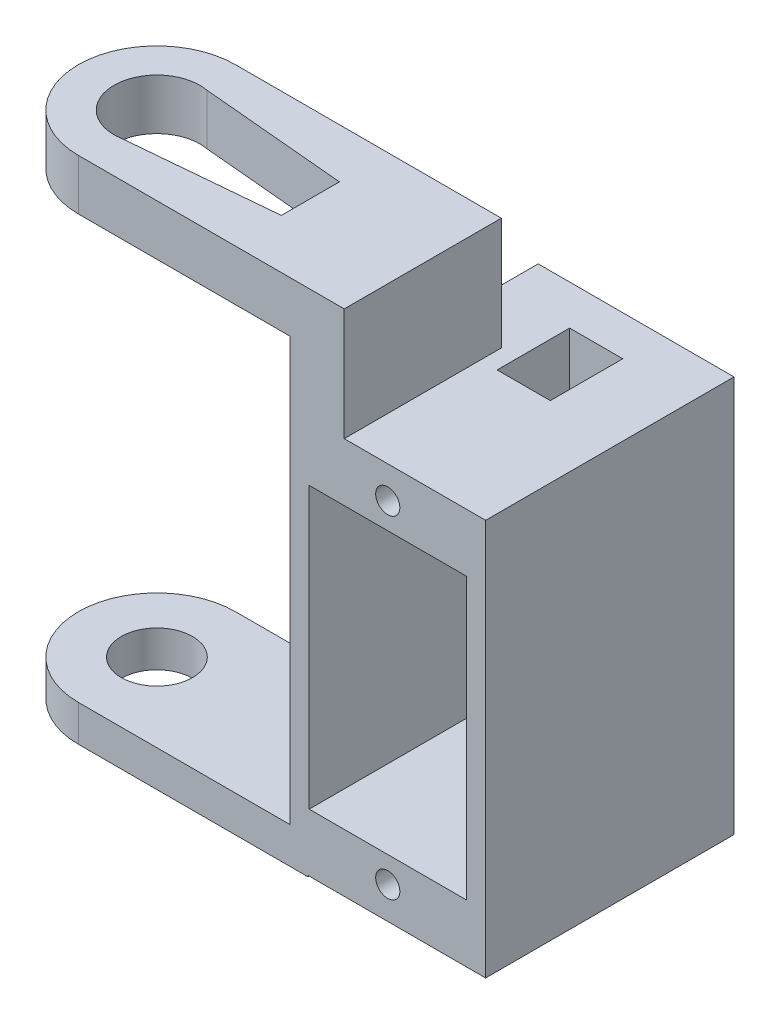
ISO-10303-21;
HEADER;
FILE_DESCRIPTION(('STEP AP214'),'2;1');
FILE_NAME('part.step','',(''),(''),'','','');
FILE_SCHEMA(('AUTOMOTIVE_DESIGN { 1 0 10303 214 1 1 1 1 }'));
ENDSEC;
DATA;
#1=APPLICATION_CONTEXT('core data for automotive mechanical design processes');
#2=APPLICATION_PROTOCOL_DEFINITION('international standard','automotive_design',2000,#1);
#3=PRODUCT_CONTEXT('',#1,'mechanical');
#4=PRODUCT('Part','Part','',(#3));
#5=PRODUCT_RELATED_PRODUCT_CATEGORY('part','',(#4));
#6=PRODUCT_DEFINITION_FORMATION('','',#4);
#7=PRODUCT_DEFINITION_CONTEXT('part definition',#1,'design');
#8=PRODUCT_DEFINITION('design','',#6,#7);
#9=PRODUCT_DEFINITION_SHAPE('','',#8);
#10=(LENGTH_UNIT() NAMED_UNIT(*) SI_UNIT(.MILLI.,.METRE.));
#11=(NAMED_UNIT(*) PLANE_ANGLE_UNIT() SI_UNIT($,.RADIAN.));
#12=(NAMED_UNIT(*) SI_UNIT($,.STERADIAN.) SOLID_ANGLE_UNIT());
#13=UNCERTAINTY_MEASURE_WITH_UNIT(LENGTH_MEASURE(1.E-05),#10,'distance_accuracy_value','');
#14=(GEOMETRIC_REPRESENTATION_CONTEXT(3) GLOBAL_UNCERTAINTY_ASSIGNED_CONTEXT((#13)) GLOBAL_UNIT_ASSIGNED_CONTEXT((#10,
#11,#12)) REPRESENTATION_CONTEXT('',''));
#15=CARTESIAN_POINT('',(0.,0.,0.));
#16=DIRECTION('',(0.,0.,1.));
#17=DIRECTION('',(1.,0.,0.));
#18=AXIS2_PLACEMENT_3D('',#15,#16,#17);
#19=CARTESIAN_POINT('',(-67.5,42.6,6.5));
#20=DIRECTION('',(1.,0.,0.));
#21=DIRECTION('',(0.,0.,-1.));
#22=AXIS2_PLACEMENT_3D('',#19,#20,#21);
#23=PLANE('',#22);
#24=DIRECTION('',(0.,-1.,0.));
#25=VECTOR('',#24,1.);
#26=CARTESIAN_POINT('',(-67.5,42.6,-6.5));
#27=LINE('',#26,#25);
#28=CARTESIAN_POINT('',(-67.5,45.5,-6.5));
#29=VERTEX_POINT('',#28);
#30=CARTESIAN_POINT('',(-67.5,42.6,-6.5));
#31=VERTEX_POINT('',#30);
#32=EDGE_CURVE('E379',#29,#31,#27,.T.);
#33=ORIENTED_EDGE('',*,*,#32,.F.);
#34=DIRECTION('',(0.,0.,-1.));
#35=VECTOR('',#34,1.);
#36=CARTESIAN_POINT('',(-67.5,45.5,6.5));
#37=LINE('',#36,#35);
#38=CARTESIAN_POINT('',(-67.5,45.5,6.5));
#39=VERTEX_POINT('',#38);
#40=EDGE_CURVE('E371',#39,#29,#37,.T.);
#41=ORIENTED_EDGE('',*,*,#40,.F.);
#42=DIRECTION('',(0.,-1.,0.));
#43=VECTOR('',#42,1.);
#44=CARTESIAN_POINT('',(-67.5,42.6,6.5));
#45=LINE('',#44,#43);
#46=CARTESIAN_POINT('',(-67.5,80.5,6.50000000000001));
#47=VERTEX_POINT('',#46);
#48=EDGE_CURVE('E470',#47,#39,#45,.T.);
#49=ORIENTED_EDGE('',*,*,#48,.F.);
#50=DIRECTION('',(0.,0.,-1.));
#51=VECTOR('',#50,1.);
#52=CARTESIAN_POINT('',(-67.5,80.5,6.5));
#53=LINE('',#52,#51);
#54=CARTESIAN_POINT('',(-67.5,80.5,-6.5));
#55=VERTEX_POINT('',#54);
#56=EDGE_CURVE('E443',#47,#55,#53,.T.);
#57=ORIENTED_EDGE('',*,*,#56,.T.);
#58=DIRECTION('',(0.,1.,0.));
#59=VECTOR('',#58,1.);
#60=CARTESIAN_POINT('',(-67.5,73.,-6.5));
#61=LINE('',#60,#59);
#62=CARTESIAN_POINT('',(-67.5,75.4,-6.5));
#63=VERTEX_POINT('',#62);
#64=EDGE_CURVE('E447',#63,#55,#61,.T.);
#65=ORIENTED_EDGE('',*,*,#64,.F.);
#66=DIRECTION('',(0.,0.,-1.));
#67=VECTOR('',#66,1.);
#68=CARTESIAN_POINT('',(-67.5,75.4,6.5));
#69=LINE('',#68,#67);
#70=CARTESIAN_POINT('',(-67.5,75.4,-14.05));
#71=VERTEX_POINT('',#70);
#72=EDGE_CURVE('E485',#63,#71,#69,.T.);
#73=ORIENTED_EDGE('',*,*,#72,.T.);
#74=DIRECTION('',(0.,-1.,0.));
#75=VECTOR('',#74,1.);
#76=CARTESIAN_POINT('',(-67.5,42.6,-14.05));
#77=LINE('',#76,#75);
#78=CARTESIAN_POINT('',(-67.5,42.6,-14.05));
#79=VERTEX_POINT('',#78);
#80=EDGE_CURVE('E469',#71,#79,#77,.T.);
#81=ORIENTED_EDGE('',*,*,#80,.T.);
#82=DIRECTION('',(0.,0.,-1.));
#83=VECTOR('',#82,1.);
#84=CARTESIAN_POINT('',(-67.5,42.6,6.5));
#85=LINE('',#84,#83);
#86=EDGE_CURVE('E508',#31,#79,#85,.T.);
#87=ORIENTED_EDGE('',*,*,#86,.F.);
#88=EDGE_LOOP('',(#33,#41,#49,#57,#65,#73,#81,#87));
#89=FACE_BOUND('',#88,.T.);
#90=ADVANCED_FACE('F39',(#89),#23,.F.);
#91=CARTESIAN_POINT('',(-67.5,42.6,6.5));
#92=DIRECTION('',(0.,1.,0.));
#93=DIRECTION('',(0.,0.,1.));
#94=AXIS2_PLACEMENT_3D('',#91,#92,#93);
#95=PLANE('',#94);
#96=DIRECTION('',(0.,0.,1.));
#97=VECTOR('',#96,1.);
#98=CARTESIAN_POINT('',(-66.,42.6,6.5));
#99=LINE('',#98,#97);
#100=CARTESIAN_POINT('',(-66.,42.6,-6.5));
#101=VERTEX_POINT('',#100);
#102=CARTESIAN_POINT('',(-66.,42.6,6.5));
#103=VERTEX_POINT('',#102);
#104=EDGE_CURVE('E375',#101,#103,#99,.T.);
#105=ORIENTED_EDGE('',*,*,#104,.F.);
#106=DIRECTION('',(1.,0.,0.));
#107=VECTOR('',#106,1.);
#108=CARTESIAN_POINT('',(-67.5,42.6,-6.5));
#109=LINE('',#108,#107);
#110=EDGE_CURVE('E11',#31,#101,#109,.T.);
#111=ORIENTED_EDGE('',*,*,#110,.F.);
#112=ORIENTED_EDGE('',*,*,#86,.T.);
#113=DIRECTION('',(1.,0.,0.));
#114=VECTOR('',#113,1.);
#115=CARTESIAN_POINT('',(-67.5,42.6,-14.05));
#116=LINE('',#115,#114);
#117=CARTESIAN_POINT('',(-51.3,42.6,-14.05));
#118=VERTEX_POINT('',#117);
#119=EDGE_CURVE('E489',#79,#118,#116,.T.);
#120=ORIENTED_EDGE('',*,*,#119,.T.);
#121=DIRECTION('',(0.,0.,-1.));
#122=VECTOR('',#121,1.);
#123=CARTESIAN_POINT('',(-51.3,42.6,6.5));
#124=LINE('',#123,#122);
#125=CARTESIAN_POINT('',(-51.3,42.6,6.5));
#126=VERTEX_POINT('',#125);
#127=EDGE_CURVE('E504',#126,#118,#124,.T.);
#128=ORIENTED_EDGE('',*,*,#127,.F.);
#129=DIRECTION('',(1.,0.,0.));
#130=VECTOR('',#129,1.);
#131=CARTESIAN_POINT('',(-67.5,42.6,6.5));
#132=LINE('',#131,#130);
#133=EDGE_CURVE('E474',#103,#126,#132,.T.);
#134=ORIENTED_EDGE('',*,*,#133,.F.);
#135=EDGE_LOOP('',(#105,#111,#112,#120,#128,#134));
#136=FACE_BOUND('',#135,.T.);
#137=ADVANCED_FACE('F551',(#136),#95,.F.);
#138=CARTESIAN_POINT('',(-67.5,75.4,6.5));
#139=DIRECTION('',(0.,-1.,0.));
#140=DIRECTION('',(0.,0.,-1.));
#141=AXIS2_PLACEMENT_3D('',#138,#139,#140);
#142=PLANE('',#141);
#143=DIRECTION('',(1.,0.,0.));
#144=VECTOR('',#143,1.);
#145=CARTESIAN_POINT('',(-61.6,75.4,-4.75));
#146=LINE('',#145,#144);
#147=CARTESIAN_POINT('',(-61.6,75.4,-4.75));
#148=VERTEX_POINT('',#147);
#149=CARTESIAN_POINT('',(-57.2,75.4,-4.75));
#150=VERTEX_POINT('',#149);
#151=EDGE_CURVE('E242',#148,#150,#146,.T.);
#152=ORIENTED_EDGE('',*,*,#151,.F.);
#153=DIRECTION('',(0.,0.,1.));
#154=VECTOR('',#153,1.);
#155=CARTESIAN_POINT('',(-61.6,75.4,-4.75));
#156=LINE('',#155,#154);
#157=CARTESIAN_POINT('',(-61.6,75.4,-10.75));
#158=VERTEX_POINT('',#157);
#159=EDGE_CURVE('E54',#158,#148,#156,.T.);
#160=ORIENTED_EDGE('',*,*,#159,.F.);
#161=DIRECTION('',(-1.,0.,0.));
#162=VECTOR('',#161,1.);
#163=CARTESIAN_POINT('',(-61.6,75.4,-10.75));
#164=LINE('',#163,#162);
#165=CARTESIAN_POINT('',(-57.2,75.4,-10.75));
#166=VERTEX_POINT('',#165);
#167=EDGE_CURVE('E231',#166,#158,#164,.T.);
#168=ORIENTED_EDGE('',*,*,#167,.F.);
#169=DIRECTION('',(0.,0.,-1.));
#170=VECTOR('',#169,1.);
#171=CARTESIAN_POINT('',(-57.2,75.4,-4.75));
#172=LINE('',#171,#170);
#173=EDGE_CURVE('E235',#150,#166,#172,.T.);
#174=ORIENTED_EDGE('',*,*,#173,.F.);
#175=EDGE_LOOP('',(#152,#160,#168,#174));
#176=FACE_BOUND('',#175,.T.);
#177=DIRECTION('',(-1.,0.,0.));
#178=VECTOR('',#177,1.);
#179=CARTESIAN_POINT('',(-67.5,75.4,-6.5));
#180=LINE('',#179,#178);
#181=CARTESIAN_POINT('',(-63.,75.4,-6.5));
#182=VERTEX_POINT('',#181);
#183=EDGE_CURVE('E511',#182,#63,#180,.T.);
#184=ORIENTED_EDGE('',*,*,#183,.F.);
#185=DIRECTION('',(0.,0.,-1.));
#186=VECTOR('',#185,1.);
#187=CARTESIAN_POINT('',(-63.,75.4,6.5));
#188=LINE('',#187,#186);
#189=CARTESIAN_POINT('',(-63.,75.4,6.5));
#190=VERTEX_POINT('',#189);
#191=EDGE_CURVE('E466',#190,#182,#188,.T.);
#192=ORIENTED_EDGE('',*,*,#191,.F.);
#193=DIRECTION('',(-1.,0.,0.));
#194=VECTOR('',#193,1.);
#195=CARTESIAN_POINT('',(-67.5,75.4,6.5));
#196=LINE('',#195,#194);
#197=CARTESIAN_POINT('',(-51.3,75.4,6.5));
#198=VERTEX_POINT('',#197);
#199=EDGE_CURVE('E481',#198,#190,#196,.T.);
#200=ORIENTED_EDGE('',*,*,#199,.F.);
#201=DIRECTION('',(0.,0.,-1.));
#202=VECTOR('',#201,1.);
#203=CARTESIAN_POINT('',(-51.3,75.4,6.5));
#204=LINE('',#203,#202);
#205=CARTESIAN_POINT('',(-51.3,75.4,-14.05));
#206=VERTEX_POINT('',#205);
#207=EDGE_CURVE('E500',#198,#206,#204,.T.);
#208=ORIENTED_EDGE('',*,*,#207,.T.);
#209=DIRECTION('',(-1.,0.,0.));
#210=VECTOR('',#209,1.);
#211=CARTESIAN_POINT('',(-67.5,75.4,-14.05));
#212=LINE('',#211,#210);
#213=EDGE_CURVE('E475',#206,#71,#212,.T.);
#214=ORIENTED_EDGE('',*,*,#213,.T.);
#215=ORIENTED_EDGE('',*,*,#72,.F.);
#216=EDGE_LOOP('',(#184,#192,#200,#208,#214,#215));
#217=FACE_BOUND('',#216,.T.);
#218=ADVANCED_FACE('F556',(#176,#217),#142,.F.);
#219=CARTESIAN_POINT('',(-51.3,42.6,6.5));
#220=DIRECTION('',(-1.,0.,0.));
#221=DIRECTION('',(0.,0.,1.));
#222=AXIS2_PLACEMENT_3D('',#219,#220,#221);
#223=PLANE('',#222);
#224=DIRECTION('',(0.,1.,0.));
#225=VECTOR('',#224,1.);
#226=CARTESIAN_POINT('',(-51.3,42.6,-14.05));
#227=LINE('',#226,#225);
#228=EDGE_CURVE('E492',#118,#206,#227,.T.);
#229=ORIENTED_EDGE('',*,*,#228,.T.);
#230=ORIENTED_EDGE('',*,*,#207,.F.);
#231=DIRECTION('',(0.,1.,0.));
#232=VECTOR('',#231,1.);
#233=CARTESIAN_POINT('',(-51.3,42.6,6.5));
#234=LINE('',#233,#232);
#235=EDGE_CURVE('E478',#126,#198,#234,.T.);
#236=ORIENTED_EDGE('',*,*,#235,.F.);
#237=ORIENTED_EDGE('',*,*,#127,.T.);
#238=EDGE_LOOP('',(#229,#230,#236,#237));
#239=FACE_BOUND('',#238,.T.);
#240=ADVANCED_FACE('F587',(#239),#223,.F.);
#241=CARTESIAN_POINT('',(0.,0.,6.5));
#242=DIRECTION('',(0.,0.,-1.));
#243=DIRECTION('',(-1.,0.,0.));
#244=AXIS2_PLACEMENT_3D('',#241,#242,#243);
#245=PLANE('',#244);
#246=CARTESIAN_POINT('',(-59.4,72.75,6.5));
#247=DIRECTION('',(0.,0.,1.));
#248=DIRECTION('',(1.,0.,0.));
#249=AXIS2_PLACEMENT_3D('',#246,#247,#248);
#250=CIRCLE('',#249,1.);
#251=CARTESIAN_POINT('',(-58.4,72.75,6.5));
#252=VERTEX_POINT('',#251);
#253=EDGE_CURVE('E261',#252,#252,#250,.T.);
#254=ORIENTED_EDGE('',*,*,#253,.F.);
#255=EDGE_LOOP('',(#254));
#256=FACE_BOUND('',#255,.T.);
#257=CARTESIAN_POINT('',(-59.4,45.25,6.5));
#258=DIRECTION('',(0.,0.,1.));
#259=DIRECTION('',(1.,0.,0.));
#260=AXIS2_PLACEMENT_3D('',#257,#258,#259);
#261=CIRCLE('',#260,1.);
#262=CARTESIAN_POINT('',(-58.4,45.25,6.5));
#263=VERTEX_POINT('',#262);
#264=EDGE_CURVE('E269',#263,#263,#261,.T.);
#265=ORIENTED_EDGE('',*,*,#264,.F.);
#266=EDGE_LOOP('',(#265));
#267=FACE_BOUND('',#266,.T.);
#268=DIRECTION('',(1.,0.,0.));
#269=VECTOR('',#268,1.);
#270=CARTESIAN_POINT('',(-65.9,47.4,6.5));
#271=LINE('',#270,#269);
#272=CARTESIAN_POINT('',(-65.9,47.4,6.5));
#273=VERTEX_POINT('',#272);
#274=CARTESIAN_POINT('',(-52.9,47.4,6.5));
#275=VERTEX_POINT('',#274);
#276=EDGE_CURVE('E301',#273,#275,#271,.T.);
#277=ORIENTED_EDGE('',*,*,#276,.F.);
#278=DIRECTION('',(0.,-1.,0.));
#279=VECTOR('',#278,1.);
#280=CARTESIAN_POINT('',(-65.9,47.4,6.5));
#281=LINE('',#280,#279);
#282=CARTESIAN_POINT('',(-65.9,70.6,6.5));
#283=VERTEX_POINT('',#282);
#284=EDGE_CURVE('E277',#283,#273,#281,.T.);
#285=ORIENTED_EDGE('',*,*,#284,.F.);
#286=DIRECTION('',(-1.,0.,0.));
#287=VECTOR('',#286,1.);
#288=CARTESIAN_POINT('',(-65.9,70.6,6.5));
#289=LINE('',#288,#287);
#290=CARTESIAN_POINT('',(-52.9,70.6,6.5));
#291=VERTEX_POINT('',#290);
#292=EDGE_CURVE('E286',#291,#283,#289,.T.);
#293=ORIENTED_EDGE('',*,*,#292,.F.);
#294=DIRECTION('',(0.,1.,0.));
#295=VECTOR('',#294,1.);
#296=CARTESIAN_POINT('',(-52.9,47.4,6.5));
#297=LINE('',#296,#295);
#298=EDGE_CURVE('E305',#275,#291,#297,.T.);
#299=ORIENTED_EDGE('',*,*,#298,.F.);
#300=EDGE_LOOP('',(#277,#285,#293,#299));
#301=FACE_BOUND('',#300,.T.);
#302=ORIENTED_EDGE('',*,*,#48,.T.);
#303=DIRECTION('',(1.,0.,0.));
#304=VECTOR('',#303,1.);
#305=CARTESIAN_POINT('',(-85.,45.5,6.50000000000001));
#306=LINE('',#305,#304);
#307=CARTESIAN_POINT('',(-85.,45.5,6.50000000000001));
#308=VERTEX_POINT('',#307);
#309=EDGE_CURVE('E341',#308,#39,#306,.T.);
#310=ORIENTED_EDGE('',*,*,#309,.F.);
#311=DIRECTION('',(0.,-1.,0.));
#312=VECTOR('',#311,1.);
#313=CARTESIAN_POINT('',(-85.,45.5,6.50000000000001));
#314=LINE('',#313,#312);
#315=CARTESIAN_POINT('',(-85.,42.5,6.50000000000001));
#316=VERTEX_POINT('',#315);
#317=EDGE_CURVE('E368',#308,#316,#314,.T.);
#318=ORIENTED_EDGE('',*,*,#317,.T.);
#319=DIRECTION('',(1.,0.,0.));
#320=VECTOR('',#319,1.);
#321=CARTESIAN_POINT('',(-85.,42.5,6.50000000000001));
#322=LINE('',#321,#320);
#323=CARTESIAN_POINT('',(-66.,42.5,6.50000000000001));
#324=VERTEX_POINT('',#323);
#325=EDGE_CURVE('E337',#316,#324,#322,.T.);
#326=ORIENTED_EDGE('',*,*,#325,.T.);
#327=DIRECTION('',(0.,-1.,0.));
#328=VECTOR('',#327,1.);
#329=CARTESIAN_POINT('',(-66.,45.5,6.50000000000001));
#330=LINE('',#329,#328);
#331=EDGE_CURVE('E365',#103,#324,#330,.T.);
#332=ORIENTED_EDGE('',*,*,#331,.F.);
#333=ORIENTED_EDGE('',*,*,#133,.T.);
#334=ORIENTED_EDGE('',*,*,#235,.T.);
#335=ORIENTED_EDGE('',*,*,#199,.T.);
#336=DIRECTION('',(0.,-1.,0.));
#337=VECTOR('',#336,1.);
#338=CARTESIAN_POINT('',(-63.,73.,6.5));
#339=LINE('',#338,#337);
#340=CARTESIAN_POINT('',(-63.,84.7,6.5));
#341=VERTEX_POINT('',#340);
#342=EDGE_CURVE('E448',#341,#190,#339,.T.);
#343=ORIENTED_EDGE('',*,*,#342,.F.);
#344=DIRECTION('',(-1.,0.,0.));
#345=VECTOR('',#344,1.);
#346=CARTESIAN_POINT('',(-63.,84.7,6.5));
#347=LINE('',#346,#345);
#348=CARTESIAN_POINT('',(-85.,84.7,6.50000000000001));
#349=VERTEX_POINT('',#348);
#350=EDGE_CURVE('E457',#341,#349,#347,.T.);
#351=ORIENTED_EDGE('',*,*,#350,.T.);
#352=DIRECTION('',(0.,-1.,0.));
#353=VECTOR('',#352,1.);
#354=CARTESIAN_POINT('',(-85.,84.7,6.50000000000001));
#355=LINE('',#354,#353);
#356=CARTESIAN_POINT('',(-85.,80.5,6.50000000000001));
#357=VERTEX_POINT('',#356);
#358=EDGE_CURVE('E440',#349,#357,#355,.T.);
#359=ORIENTED_EDGE('',*,*,#358,.T.);
#360=DIRECTION('',(1.,0.,0.));
#361=VECTOR('',#360,1.);
#362=CARTESIAN_POINT('',(-85.,80.5,6.50000000000001));
#363=LINE('',#362,#361);
#364=EDGE_CURVE('E426',#357,#47,#363,.T.);
#365=ORIENTED_EDGE('',*,*,#364,.T.);
#366=EDGE_LOOP('',(#302,#310,#318,#326,#332,#333,#334,#335,#343,#351,#359,#365));
#367=FACE_BOUND('',#366,.T.);
#368=ADVANCED_FACE('F573',(#256,#267,#301,#367),#245,.F.);
#369=CARTESIAN_POINT('',(0.,0.,-14.05));
#370=DIRECTION('',(0.,0.,-1.));
#371=DIRECTION('',(-1.,0.,0.));
#372=AXIS2_PLACEMENT_3D('',#369,#370,#371);
#373=PLANE('',#372);
#374=CARTESIAN_POINT('',(-59.4,64.5,-14.05));
#375=DIRECTION('',(0.,0.,1.));
#376=DIRECTION('',(1.,0.,0.));
#377=AXIS2_PLACEMENT_3D('',#374,#375,#376);
#378=CIRCLE('',#377,3.15);
#379=CARTESIAN_POINT('',(-56.25,64.5,-14.05));
#380=VERTEX_POINT('',#379);
#381=EDGE_CURVE('E257',#380,#380,#378,.T.);
#382=ORIENTED_EDGE('',*,*,#381,.T.);
#383=EDGE_LOOP('',(#382));
#384=FACE_BOUND('',#383,.T.);
#385=ORIENTED_EDGE('',*,*,#80,.F.);
#386=ORIENTED_EDGE('',*,*,#213,.F.);
#387=ORIENTED_EDGE('',*,*,#228,.F.);
#388=ORIENTED_EDGE('',*,*,#119,.F.);
#389=EDGE_LOOP('',(#385,#386,#387,#388));
#390=FACE_BOUND('',#389,.T.);
#391=ADVANCED_FACE('F612',(#384,#390),#373,.T.);
#392=CARTESIAN_POINT('',(-63.,73.,-6.5));
#393=DIRECTION('',(0.,0.,1.));
#394=DIRECTION('',(1.,0.,0.));
#395=AXIS2_PLACEMENT_3D('',#392,#393,#394);
#396=PLANE('',#395);
#397=DIRECTION('',(0.,-1.,0.));
#398=VECTOR('',#397,1.);
#399=CARTESIAN_POINT('',(-85.,84.7,-6.5));
#400=LINE('',#399,#398);
#401=CARTESIAN_POINT('',(-85.,84.7,-6.5));
#402=VERTEX_POINT('',#401);
#403=CARTESIAN_POINT('',(-85.,80.5,-6.5));
#404=VERTEX_POINT('',#403);
#405=EDGE_CURVE('E436',#402,#404,#400,.T.);
#406=ORIENTED_EDGE('',*,*,#405,.F.);
#407=DIRECTION('',(-1.,0.,0.));
#408=VECTOR('',#407,1.);
#409=CARTESIAN_POINT('',(-63.,84.7,-6.5));
#410=LINE('',#409,#408);
#411=CARTESIAN_POINT('',(-63.,84.7,-6.5));
#412=VERTEX_POINT('',#411);
#413=EDGE_CURVE('E463',#412,#402,#410,.T.);
#414=ORIENTED_EDGE('',*,*,#413,.F.);
#415=DIRECTION('',(0.,1.,0.));
#416=VECTOR('',#415,1.);
#417=CARTESIAN_POINT('',(-63.,73.,-6.5));
#418=LINE('',#417,#416);
#419=EDGE_CURVE('E451',#182,#412,#418,.T.);
#420=ORIENTED_EDGE('',*,*,#419,.F.);
#421=ORIENTED_EDGE('',*,*,#183,.T.);
#422=ORIENTED_EDGE('',*,*,#64,.T.);
#423=DIRECTION('',(-1.,0.,0.));
#424=VECTOR('',#423,1.);
#425=CARTESIAN_POINT('',(-85.,80.5,-6.5));
#426=LINE('',#425,#424);
#427=EDGE_CURVE('E433',#55,#404,#426,.T.);
#428=ORIENTED_EDGE('',*,*,#427,.T.);
#429=EDGE_LOOP('',(#406,#414,#420,#421,#422,#428));
#430=FACE_BOUND('',#429,.T.);
#431=ADVANCED_FACE('F608',(#430),#396,.F.);
#432=CARTESIAN_POINT('',(-63.,0.,0.));
#433=DIRECTION('',(-1.,0.,0.));
#434=DIRECTION('',(0.,0.,1.));
#435=AXIS2_PLACEMENT_3D('',#432,#433,#434);
#436=PLANE('',#435);
#437=ORIENTED_EDGE('',*,*,#342,.T.);
#438=ORIENTED_EDGE('',*,*,#191,.T.);
#439=ORIENTED_EDGE('',*,*,#419,.T.);
#440=DIRECTION('',(0.,0.,1.));
#441=VECTOR('',#440,1.);
#442=CARTESIAN_POINT('',(-63.,84.7,6.5));
#443=LINE('',#442,#441);
#444=EDGE_CURVE('E454',#412,#341,#443,.T.);
#445=ORIENTED_EDGE('',*,*,#444,.T.);
#446=EDGE_LOOP('',(#437,#438,#439,#445));
#447=FACE_BOUND('',#446,.T.);
#448=ADVANCED_FACE('F597',(#447),#436,.F.);
#449=CARTESIAN_POINT('',(-63.,84.7,6.5));
#450=DIRECTION('',(0.,-1.,0.));
#451=DIRECTION('',(0.,0.,-1.));
#452=AXIS2_PLACEMENT_3D('',#449,#450,#451);
#453=PLANE('',#452);
#454=CARTESIAN_POINT('',(-85.,84.7,0.));
#455=DIRECTION('',(0.,1.,0.));
#456=DIRECTION('',(0.,0.,1.));
#457=AXIS2_PLACEMENT_3D('',#454,#455,#456);
#458=CIRCLE('',#457,3.55);
#459=CARTESIAN_POINT('',(-84.3641054158039,84.7,-3.49258329575545));
#460=VERTEX_POINT('',#459);
#461=CARTESIAN_POINT('',(-84.3641054158039,84.7,3.49258329575545));
#462=VERTEX_POINT('',#461);
#463=EDGE_CURVE('E410',#460,#462,#458,.T.);
#464=ORIENTED_EDGE('',*,*,#463,.F.);
#465=DIRECTION('',(-0.995948362239352,0.,-0.0899269689956983));
#466=VECTOR('',#465,1.);
#467=CARTESIAN_POINT('',(-72.3,84.7,-2.40328140539589));
#468=LINE('',#467,#466);
#469=CARTESIAN_POINT('',(-72.3,84.7,-2.40328140539589));
#470=VERTEX_POINT('',#469);
#471=EDGE_CURVE('E389',#470,#460,#468,.T.);
#472=ORIENTED_EDGE('',*,*,#471,.F.);
#473=DIRECTION('',(0.,0.,-1.));
#474=VECTOR('',#473,1.);
#475=CARTESIAN_POINT('',(-72.3,84.7,2.40328140539589));
#476=LINE('',#475,#474);
#477=CARTESIAN_POINT('',(-72.3,84.7,2.40328140539589));
#478=VERTEX_POINT('',#477);
#479=EDGE_CURVE('E400',#478,#470,#476,.T.);
#480=ORIENTED_EDGE('',*,*,#479,.F.);
#481=DIRECTION('',(0.995948362239352,0.,-0.0899269689956983));
#482=VECTOR('',#481,1.);
#483=CARTESIAN_POINT('',(-85.,84.7,3.55));
#484=LINE('',#483,#482);
#485=EDGE_CURVE('E383',#462,#478,#484,.T.);
#486=ORIENTED_EDGE('',*,*,#485,.F.);
#487=EDGE_LOOP('',(#464,#472,#480,#486));
#488=FACE_BOUND('',#487,.T.);
#489=ORIENTED_EDGE('',*,*,#413,.T.);
#490=CARTESIAN_POINT('',(-85.,84.7,0.));
#491=DIRECTION('',(0.,1.,0.));
#492=DIRECTION('',(0.,0.,1.));
#493=AXIS2_PLACEMENT_3D('',#490,#491,#492);
#494=CIRCLE('',#493,6.50000000000001);
#495=EDGE_CURVE('E422',#402,#349,#494,.T.);
#496=ORIENTED_EDGE('',*,*,#495,.T.);
#497=ORIENTED_EDGE('',*,*,#350,.F.);
#498=ORIENTED_EDGE('',*,*,#444,.F.);
#499=EDGE_LOOP('',(#489,#496,#497,#498));
#500=FACE_BOUND('',#499,.T.);
#501=ADVANCED_FACE('F536',(#488,#500),#453,.F.);
#502=CARTESIAN_POINT('',(0.,80.5,0.));
#503=DIRECTION('',(0.,-1.,0.));
#504=DIRECTION('',(0.,0.,-1.));
#505=AXIS2_PLACEMENT_3D('',#502,#503,#504);
#506=PLANE('',#505);
#507=DIRECTION('',(-0.995948362239352,0.,-0.0899269689956983));
#508=VECTOR('',#507,1.);
#509=CARTESIAN_POINT('',(-72.3,80.5,-2.40328140539589));
#510=LINE('',#509,#508);
#511=CARTESIAN_POINT('',(-72.3,80.5,-2.40328140539589));
#512=VERTEX_POINT('',#511);
#513=CARTESIAN_POINT('',(-84.3641054158039,80.5,-3.49258329575545));
#514=VERTEX_POINT('',#513);
#515=EDGE_CURVE('E393',#512,#514,#510,.T.);
#516=ORIENTED_EDGE('',*,*,#515,.T.);
#517=CARTESIAN_POINT('',(-85.,80.5,0.));
#518=DIRECTION('',(0.,1.,0.));
#519=DIRECTION('',(0.,0.,1.));
#520=AXIS2_PLACEMENT_3D('',#517,#518,#519);
#521=CIRCLE('',#520,3.55);
#522=CARTESIAN_POINT('',(-84.3641054158039,80.5,3.49258329575545));
#523=VERTEX_POINT('',#522);
#524=EDGE_CURVE('E414',#514,#523,#521,.T.);
#525=ORIENTED_EDGE('',*,*,#524,.T.);
#526=DIRECTION('',(0.995948362239352,0.,-0.0899269689956983));
#527=VECTOR('',#526,1.);
#528=CARTESIAN_POINT('',(-85.,80.5,3.55));
#529=LINE('',#528,#527);
#530=CARTESIAN_POINT('',(-72.3,80.5,2.40328140539589));
#531=VERTEX_POINT('',#530);
#532=EDGE_CURVE('E384',#523,#531,#529,.T.);
#533=ORIENTED_EDGE('',*,*,#532,.T.);
#534=DIRECTION('',(0.,0.,-1.));
#535=VECTOR('',#534,1.);
#536=CARTESIAN_POINT('',(-72.3,80.5,2.40328140539589));
#537=LINE('',#536,#535);
#538=EDGE_CURVE('E388',#531,#512,#537,.T.);
#539=ORIENTED_EDGE('',*,*,#538,.T.);
#540=EDGE_LOOP('',(#516,#525,#533,#539));
#541=FACE_BOUND('',#540,.T.);
#542=ORIENTED_EDGE('',*,*,#364,.F.);
#543=CARTESIAN_POINT('',(-85.,80.5,0.));
#544=DIRECTION('',(0.,1.,0.));
#545=DIRECTION('',(0.,0.,1.));
#546=AXIS2_PLACEMENT_3D('',#543,#544,#545);
#547=CIRCLE('',#546,6.50000000000001);
#548=EDGE_CURVE('E418',#404,#357,#547,.T.);
#549=ORIENTED_EDGE('',*,*,#548,.F.);
#550=ORIENTED_EDGE('',*,*,#427,.F.);
#551=ORIENTED_EDGE('',*,*,#56,.F.);
#552=EDGE_LOOP('',(#542,#549,#550,#551));
#553=FACE_BOUND('',#552,.T.);
#554=ADVANCED_FACE('F528',(#541,#553),#506,.T.);
#555=CARTESIAN_POINT('',(-85.,84.7,0.));
#556=DIRECTION('',(0.,-1.,0.));
#557=DIRECTION('',(0.,0.,-1.));
#558=AXIS2_PLACEMENT_3D('',#555,#556,#557);
#559=CYLINDRICAL_SURFACE('',#558,6.50000000000001);
#560=ORIENTED_EDGE('',*,*,#548,.T.);
#561=ORIENTED_EDGE('',*,*,#358,.F.);
#562=ORIENTED_EDGE('',*,*,#495,.F.);
#563=ORIENTED_EDGE('',*,*,#405,.T.);
#564=EDGE_LOOP('',(#560,#561,#562,#563));
#565=FACE_BOUND('',#564,.T.);
#566=ADVANCED_FACE('F604',(#565),#559,.T.);
#567=CARTESIAN_POINT('',(-85.,80.5,0.));
#568=DIRECTION('',(0.,1.,0.));
#569=DIRECTION('',(0.,0.,1.));
#570=AXIS2_PLACEMENT_3D('',#567,#568,#569);
#571=CYLINDRICAL_SURFACE('',#570,3.55);
#572=ORIENTED_EDGE('',*,*,#463,.T.);
#573=DIRECTION('',(0.,1.,0.));
#574=VECTOR('',#573,1.);
#575=CARTESIAN_POINT('',(-84.3641054158039,80.5,3.49258329575545));
#576=LINE('',#575,#574);
#577=EDGE_CURVE('E515',#462,#523,#576,.F.);
#578=ORIENTED_EDGE('',*,*,#577,.T.);
#579=ORIENTED_EDGE('',*,*,#524,.F.);
#580=DIRECTION('',(0.,1.,0.));
#581=VECTOR('',#580,1.);
#582=CARTESIAN_POINT('',(-84.3641054158039,80.5,-3.49258329575545));
#583=LINE('',#582,#581);
#584=EDGE_CURVE('E47',#514,#460,#583,.T.);
#585=ORIENTED_EDGE('',*,*,#584,.T.);
#586=EDGE_LOOP('',(#572,#578,#579,#585));
#587=FACE_BOUND('',#586,.T.);
#588=ADVANCED_FACE('F522',(#587),#571,.F.);
#589=CARTESIAN_POINT('',(-72.3,80.5,-2.40328140539589));
#590=DIRECTION('',(0.0899269689956983,0.,-0.995948362239352));
#591=DIRECTION('',(-0.995948362239352,0.,-0.0899269689956983));
#592=AXIS2_PLACEMENT_3D('',#589,#590,#591);
#593=PLANE('',#592);
#594=ORIENTED_EDGE('',*,*,#515,.F.);
#595=DIRECTION('',(0.,1.,0.));
#596=VECTOR('',#595,1.);
#597=CARTESIAN_POINT('',(-72.3,80.5,-2.40328140539589));
#598=LINE('',#597,#596);
#599=EDGE_CURVE('E407',#512,#470,#598,.T.);
#600=ORIENTED_EDGE('',*,*,#599,.T.);
#601=ORIENTED_EDGE('',*,*,#471,.T.);
#602=ORIENTED_EDGE('',*,*,#584,.F.);
#603=EDGE_LOOP('',(#594,#600,#601,#602));
#604=FACE_BOUND('',#603,.T.);
#605=ADVANCED_FACE('F525',(#604),#593,.F.);
#606=CARTESIAN_POINT('',(-85.,80.5,3.55));
#607=DIRECTION('',(0.0899269689956983,0.,0.995948362239352));
#608=DIRECTION('',(0.995948362239352,0.,-0.0899269689956983));
#609=AXIS2_PLACEMENT_3D('',#606,#607,#608);
#610=PLANE('',#609);
#611=ORIENTED_EDGE('',*,*,#485,.T.);
#612=DIRECTION('',(0.,1.,0.));
#613=VECTOR('',#612,1.);
#614=CARTESIAN_POINT('',(-72.3,80.5,2.40328140539589));
#615=LINE('',#614,#613);
#616=EDGE_CURVE('E397',#531,#478,#615,.T.);
#617=ORIENTED_EDGE('',*,*,#616,.F.);
#618=ORIENTED_EDGE('',*,*,#532,.F.);
#619=ORIENTED_EDGE('',*,*,#577,.F.);
#620=EDGE_LOOP('',(#611,#617,#618,#619));
#621=FACE_BOUND('',#620,.T.);
#622=ADVANCED_FACE('F539',(#621),#610,.F.);
#623=CARTESIAN_POINT('',(-72.3,80.5,2.40328140539589));
#624=DIRECTION('',(1.,0.,0.));
#625=DIRECTION('',(0.,0.,-1.));
#626=AXIS2_PLACEMENT_3D('',#623,#624,#625);
#627=PLANE('',#626);
#628=ORIENTED_EDGE('',*,*,#479,.T.);
#629=ORIENTED_EDGE('',*,*,#599,.F.);
#630=ORIENTED_EDGE('',*,*,#538,.F.);
#631=ORIENTED_EDGE('',*,*,#616,.T.);
#632=EDGE_LOOP('',(#628,#629,#630,#631));
#633=FACE_BOUND('',#632,.T.);
#634=ADVANCED_FACE('F532',(#633),#627,.F.);
#635=CARTESIAN_POINT('',(-85.,45.5,-6.5));
#636=DIRECTION('',(0.,0.,1.));
#637=DIRECTION('',(1.,0.,0.));
#638=AXIS2_PLACEMENT_3D('',#635,#636,#637);
#639=PLANE('',#638);
#640=DIRECTION('',(-1.,0.,0.));
#641=VECTOR('',#640,1.);
#642=CARTESIAN_POINT('',(-85.,45.5,-6.5));
#643=LINE('',#642,#641);
#644=CARTESIAN_POINT('',(-85.,45.5,-6.5));
#645=VERTEX_POINT('',#644);
#646=EDGE_CURVE('E345',#29,#645,#643,.T.);
#647=ORIENTED_EDGE('',*,*,#646,.F.);
#648=ORIENTED_EDGE('',*,*,#32,.T.);
#649=ORIENTED_EDGE('',*,*,#110,.T.);
#650=DIRECTION('',(0.,-1.,0.));
#651=VECTOR('',#650,1.);
#652=CARTESIAN_POINT('',(-66.,45.5,-6.5));
#653=LINE('',#652,#651);
#654=CARTESIAN_POINT('',(-66.,42.5,-6.5));
#655=VERTEX_POINT('',#654);
#656=EDGE_CURVE('E362',#101,#655,#653,.T.);
#657=ORIENTED_EDGE('',*,*,#656,.T.);
#658=DIRECTION('',(-1.,0.,0.));
#659=VECTOR('',#658,1.);
#660=CARTESIAN_POINT('',(-85.,42.5,-6.5));
#661=LINE('',#660,#659);
#662=CARTESIAN_POINT('',(-85.,42.5,-6.5));
#663=VERTEX_POINT('',#662);
#664=EDGE_CURVE('E346',#655,#663,#661,.T.);
#665=ORIENTED_EDGE('',*,*,#664,.T.);
#666=DIRECTION('',(0.,-1.,0.));
#667=VECTOR('',#666,1.);
#668=CARTESIAN_POINT('',(-85.,45.5,-6.5));
#669=LINE('',#668,#667);
#670=EDGE_CURVE('E349',#645,#663,#669,.T.);
#671=ORIENTED_EDGE('',*,*,#670,.F.);
#672=EDGE_LOOP('',(#647,#648,#649,#657,#665,#671));
#673=FACE_BOUND('',#672,.T.);
#674=ADVANCED_FACE('F546',(#673),#639,.F.);
#675=CARTESIAN_POINT('',(-66.,45.5,6.50000000000001));
#676=DIRECTION('',(-1.,0.,0.));
#677=DIRECTION('',(0.,0.,1.));
#678=AXIS2_PLACEMENT_3D('',#675,#676,#677);
#679=PLANE('',#678);
#680=ORIENTED_EDGE('',*,*,#656,.F.);
#681=ORIENTED_EDGE('',*,*,#104,.T.);
#682=ORIENTED_EDGE('',*,*,#331,.T.);
#683=DIRECTION('',(0.,0.,-1.));
#684=VECTOR('',#683,1.);
#685=CARTESIAN_POINT('',(-66.,42.5,6.50000000000001));
#686=LINE('',#685,#684);
#687=EDGE_CURVE('E353',#324,#655,#686,.T.);
#688=ORIENTED_EDGE('',*,*,#687,.T.);
#689=EDGE_LOOP('',(#680,#681,#682,#688));
#690=FACE_BOUND('',#689,.T.);
#691=ADVANCED_FACE('F580',(#690),#679,.F.);
#692=CARTESIAN_POINT('',(0.,45.5,0.));
#693=DIRECTION('',(0.,-1.,0.));
#694=DIRECTION('',(0.,0.,-1.));
#695=AXIS2_PLACEMENT_3D('',#692,#693,#694);
#696=PLANE('',#695);
#697=CARTESIAN_POINT('',(-85.,45.5,0.));
#698=DIRECTION('',(0.,1.,0.));
#699=DIRECTION('',(0.,0.,1.));
#700=AXIS2_PLACEMENT_3D('',#697,#698,#699);
#701=CIRCLE('',#700,2.94999999999999);
#702=CARTESIAN_POINT('',(-85.,45.5,2.94999999999999));
#703=VERTEX_POINT('',#702);
#704=EDGE_CURVE('E315',#703,#703,#701,.T.);
#705=ORIENTED_EDGE('',*,*,#704,.F.);
#706=EDGE_LOOP('',(#705));
#707=FACE_BOUND('',#706,.T.);
#708=ORIENTED_EDGE('',*,*,#646,.T.);
#709=CARTESIAN_POINT('',(-85.,45.5,0.));
#710=DIRECTION('',(0.,1.,0.));
#711=DIRECTION('',(0.,0.,1.));
#712=AXIS2_PLACEMENT_3D('',#709,#710,#711);
#713=CIRCLE('',#712,6.50000000000001);
#714=EDGE_CURVE('E333',#645,#308,#713,.T.);
#715=ORIENTED_EDGE('',*,*,#714,.T.);
#716=ORIENTED_EDGE('',*,*,#309,.T.);
#717=ORIENTED_EDGE('',*,*,#40,.T.);
#718=EDGE_LOOP('',(#708,#715,#716,#717));
#719=FACE_BOUND('',#718,.T.);
#720=ADVANCED_FACE('F563',(#707,#719),#696,.F.);
#721=CARTESIAN_POINT('',(0.,42.5,0.));
#722=DIRECTION('',(0.,-1.,0.));
#723=DIRECTION('',(0.,0.,-1.));
#724=AXIS2_PLACEMENT_3D('',#721,#722,#723);
#725=PLANE('',#724);
#726=CARTESIAN_POINT('',(-85.,42.5,0.));
#727=DIRECTION('',(0.,1.,0.));
#728=DIRECTION('',(0.,0.,1.));
#729=AXIS2_PLACEMENT_3D('',#726,#727,#728);
#730=CIRCLE('',#729,2.94999999999999);
#731=CARTESIAN_POINT('',(-85.,42.5,2.94999999999999));
#732=VERTEX_POINT('',#731);
#733=EDGE_CURVE('E325',#732,#732,#730,.T.);
#734=ORIENTED_EDGE('',*,*,#733,.T.);
#735=EDGE_LOOP('',(#734));
#736=FACE_BOUND('',#735,.T.);
#737=ORIENTED_EDGE('',*,*,#325,.F.);
#738=CARTESIAN_POINT('',(-85.,42.5,0.));
#739=DIRECTION('',(0.,1.,0.));
#740=DIRECTION('',(0.,0.,1.));
#741=AXIS2_PLACEMENT_3D('',#738,#739,#740);
#742=CIRCLE('',#741,6.50000000000001);
#743=EDGE_CURVE('E329',#663,#316,#742,.T.);
#744=ORIENTED_EDGE('',*,*,#743,.F.);
#745=ORIENTED_EDGE('',*,*,#664,.F.);
#746=ORIENTED_EDGE('',*,*,#687,.F.);
#747=EDGE_LOOP('',(#737,#744,#745,#746));
#748=FACE_BOUND('',#747,.T.);
#749=ADVANCED_FACE('F577',(#736,#748),#725,.T.);
#750=CARTESIAN_POINT('',(-85.,45.5,0.));
#751=DIRECTION('',(0.,-1.,0.));
#752=DIRECTION('',(0.,0.,-1.));
#753=AXIS2_PLACEMENT_3D('',#750,#751,#752);
#754=CYLINDRICAL_SURFACE('',#753,6.50000000000001);
#755=ORIENTED_EDGE('',*,*,#743,.T.);
#756=ORIENTED_EDGE('',*,*,#317,.F.);
#757=ORIENTED_EDGE('',*,*,#714,.F.);
#758=ORIENTED_EDGE('',*,*,#670,.T.);
#759=EDGE_LOOP('',(#755,#756,#757,#758));
#760=FACE_BOUND('',#759,.T.);
#761=ADVANCED_FACE('F570',(#760),#754,.T.);
#762=CARTESIAN_POINT('',(-85.,42.5,0.));
#763=DIRECTION('',(0.,1.,0.));
#764=DIRECTION('',(0.,0.,1.));
#765=AXIS2_PLACEMENT_3D('',#762,#763,#764);
#766=CYLINDRICAL_SURFACE('',#765,2.94999999999999);
#767=ORIENTED_EDGE('',*,*,#733,.F.);
#768=EDGE_LOOP('',(#767));
#769=FACE_BOUND('',#768,.T.);
#770=ORIENTED_EDGE('',*,*,#704,.T.);
#771=EDGE_LOOP('',(#770));
#772=FACE_BOUND('',#771,.T.);
#773=ADVANCED_FACE('F765',(#769,#772),#766,.F.);
#774=CARTESIAN_POINT('',(-65.9,47.4,-10.75));
#775=DIRECTION('',(-1.,0.,0.));
#776=DIRECTION('',(0.,0.,1.));
#777=AXIS2_PLACEMENT_3D('',#774,#775,#776);
#778=PLANE('',#777);
#779=ORIENTED_EDGE('',*,*,#284,.T.);
#780=DIRECTION('',(0.,0.,1.));
#781=VECTOR('',#780,1.);
#782=CARTESIAN_POINT('',(-65.9,47.4,-10.75));
#783=LINE('',#782,#781);
#784=CARTESIAN_POINT('',(-65.9,47.4,-10.75));
#785=VERTEX_POINT('',#784);
#786=EDGE_CURVE('E298',#785,#273,#783,.T.);
#787=ORIENTED_EDGE('',*,*,#786,.F.);
#788=DIRECTION('',(0.,-1.,0.));
#789=VECTOR('',#788,1.);
#790=CARTESIAN_POINT('',(-65.9,47.4,-10.75));
#791=LINE('',#790,#789);
#792=CARTESIAN_POINT('',(-65.9,70.6,-10.75));
#793=VERTEX_POINT('',#792);
#794=EDGE_CURVE('E281',#793,#785,#791,.T.);
#795=ORIENTED_EDGE('',*,*,#794,.F.);
#796=DIRECTION('',(0.,0.,1.));
#797=VECTOR('',#796,1.);
#798=CARTESIAN_POINT('',(-65.9,70.6,-10.75));
#799=LINE('',#798,#797);
#800=EDGE_CURVE('E312',#793,#283,#799,.T.);
#801=ORIENTED_EDGE('',*,*,#800,.T.);
#802=EDGE_LOOP('',(#779,#787,#795,#801));
#803=FACE_BOUND('',#802,.T.);
#804=ADVANCED_FACE('F708',(#803),#778,.F.);
#805=CARTESIAN_POINT('',(-65.9,70.6,-10.75));
#806=DIRECTION('',(0.,1.,0.));
#807=DIRECTION('',(0.,0.,1.));
#808=AXIS2_PLACEMENT_3D('',#805,#806,#807);
#809=PLANE('',#808);
#810=DIRECTION('',(-1.,0.,0.));
#811=VECTOR('',#810,1.);
#812=CARTESIAN_POINT('',(-65.9,70.6,-10.75));
#813=LINE('',#812,#811);
#814=CARTESIAN_POINT('',(-61.6,70.6,-10.75));
#815=VERTEX_POINT('',#814);
#816=EDGE_CURVE('E229',#815,#793,#813,.T.);
#817=ORIENTED_EDGE('',*,*,#816,.F.);
#818=DIRECTION('',(0.,0.,1.));
#819=VECTOR('',#818,1.);
#820=CARTESIAN_POINT('',(-61.6,70.6,-4.75));
#821=LINE('',#820,#819);
#822=CARTESIAN_POINT('',(-61.6,70.6,-4.75));
#823=VERTEX_POINT('',#822);
#824=EDGE_CURVE('E59',#815,#823,#821,.T.);
#825=ORIENTED_EDGE('',*,*,#824,.T.);
#826=DIRECTION('',(1.,0.,0.));
#827=VECTOR('',#826,1.);
#828=CARTESIAN_POINT('',(-61.6,70.6,-4.75));
#829=LINE('',#828,#827);
#830=CARTESIAN_POINT('',(-57.2,70.6,-4.75));
#831=VERTEX_POINT('',#830);
#832=EDGE_CURVE('E219',#823,#831,#829,.T.);
#833=ORIENTED_EDGE('',*,*,#832,.T.);
#834=DIRECTION('',(0.,0.,-1.));
#835=VECTOR('',#834,1.);
#836=CARTESIAN_POINT('',(-57.2,70.6,-4.75));
#837=LINE('',#836,#835);
#838=CARTESIAN_POINT('',(-57.2,70.6,-10.75));
#839=VERTEX_POINT('',#838);
#840=EDGE_CURVE('E216',#831,#839,#837,.T.);
#841=ORIENTED_EDGE('',*,*,#840,.T.);
#842=CARTESIAN_POINT('',(-52.9,70.6,-10.75));
#843=VERTEX_POINT('',#842);
#844=EDGE_CURVE('E294',#843,#839,#813,.T.);
#845=ORIENTED_EDGE('',*,*,#844,.F.);
#846=DIRECTION('',(0.,0.,1.));
#847=VECTOR('',#846,1.);
#848=CARTESIAN_POINT('',(-52.9,70.6,-10.75));
#849=LINE('',#848,#847);
#850=EDGE_CURVE('E316',#843,#291,#849,.T.);
#851=ORIENTED_EDGE('',*,*,#850,.T.);
#852=ORIENTED_EDGE('',*,*,#292,.T.);
#853=ORIENTED_EDGE('',*,*,#800,.F.);
#854=EDGE_LOOP('',(#817,#825,#833,#841,#845,#851,#852,#853));
#855=FACE_BOUND('',#854,.T.);
#856=ADVANCED_FACE('F227',(#855),#809,.F.);
#857=CARTESIAN_POINT('',(-52.9,47.4,-10.75));
#858=DIRECTION('',(1.,0.,0.));
#859=DIRECTION('',(0.,0.,-1.));
#860=AXIS2_PLACEMENT_3D('',#857,#858,#859);
#861=PLANE('',#860);
#862=ORIENTED_EDGE('',*,*,#298,.T.);
#863=ORIENTED_EDGE('',*,*,#850,.F.);
#864=DIRECTION('',(0.,1.,0.));
#865=VECTOR('',#864,1.);
#866=CARTESIAN_POINT('',(-52.9,47.4,-10.75));
#867=LINE('',#866,#865);
#868=CARTESIAN_POINT('',(-52.9,47.4,-10.75));
#869=VERTEX_POINT('',#868);
#870=EDGE_CURVE('E290',#869,#843,#867,.T.);
#871=ORIENTED_EDGE('',*,*,#870,.F.);
#872=DIRECTION('',(0.,0.,1.));
#873=VECTOR('',#872,1.);
#874=CARTESIAN_POINT('',(-52.9,47.4,-10.75));
#875=LINE('',#874,#873);
#876=EDGE_CURVE('E319',#869,#275,#875,.T.);
#877=ORIENTED_EDGE('',*,*,#876,.T.);
#878=EDGE_LOOP('',(#862,#863,#871,#877));
#879=FACE_BOUND('',#878,.T.);
#880=ADVANCED_FACE('F707',(#879),#861,.F.);
#881=CARTESIAN_POINT('',(-65.9,47.4,-10.75));
#882=DIRECTION('',(0.,-1.,0.));
#883=DIRECTION('',(0.,0.,-1.));
#884=AXIS2_PLACEMENT_3D('',#881,#882,#883);
#885=PLANE('',#884);
#886=ORIENTED_EDGE('',*,*,#276,.T.);
#887=ORIENTED_EDGE('',*,*,#876,.F.);
#888=DIRECTION('',(1.,0.,0.));
#889=VECTOR('',#888,1.);
#890=CARTESIAN_POINT('',(-65.9,47.4,-10.75));
#891=LINE('',#890,#889);
#892=EDGE_CURVE('E285',#785,#869,#891,.T.);
#893=ORIENTED_EDGE('',*,*,#892,.F.);
#894=ORIENTED_EDGE('',*,*,#786,.T.);
#895=EDGE_LOOP('',(#886,#887,#893,#894));
#896=FACE_BOUND('',#895,.T.);
#897=ADVANCED_FACE('F722',(#896),#885,.F.);
#898=CARTESIAN_POINT('',(0.,0.,-10.75));
#899=DIRECTION('',(0.,0.,-1.));
#900=DIRECTION('',(-1.,0.,0.));
#901=AXIS2_PLACEMENT_3D('',#898,#899,#900);
#902=PLANE('',#901);
#903=ORIENTED_EDGE('',*,*,#794,.T.);
#904=ORIENTED_EDGE('',*,*,#892,.T.);
#905=ORIENTED_EDGE('',*,*,#870,.T.);
#906=ORIENTED_EDGE('',*,*,#844,.T.);
#907=DIRECTION('',(0.,1.,0.));
#908=VECTOR('',#907,1.);
#909=CARTESIAN_POINT('',(-57.2,70.6,-10.75));
#910=LINE('',#909,#908);
#911=EDGE_CURVE('E252',#839,#166,#910,.T.);
#912=ORIENTED_EDGE('',*,*,#911,.T.);
#913=ORIENTED_EDGE('',*,*,#167,.T.);
#914=DIRECTION('',(0.,1.,0.));
#915=VECTOR('',#914,1.);
#916=CARTESIAN_POINT('',(-61.6,70.6,-10.75));
#917=LINE('',#916,#915);
#918=EDGE_CURVE('E248',#815,#158,#917,.T.);
#919=ORIENTED_EDGE('',*,*,#918,.F.);
#920=ORIENTED_EDGE('',*,*,#816,.T.);
#921=EDGE_LOOP('',(#903,#904,#905,#906,#912,#913,#919,#920));
#922=FACE_BOUND('',#921,.T.);
#923=ADVANCED_FACE('F717',(#922),#902,.F.);
#924=CARTESIAN_POINT('',(-59.4,45.25,0.5));
#925=DIRECTION('',(0.,0.,1.));
#926=DIRECTION('',(1.,0.,0.));
#927=AXIS2_PLACEMENT_3D('',#924,#925,#926);
#928=CYLINDRICAL_SURFACE('',#927,1.);
#929=CARTESIAN_POINT('',(-59.4,45.25,0.5));
#930=DIRECTION('',(0.,0.,1.));
#931=DIRECTION('',(1.,0.,0.));
#932=AXIS2_PLACEMENT_3D('',#929,#930,#931);
#933=CIRCLE('',#932,1.);
#934=CARTESIAN_POINT('',(-58.4,45.25,0.5));
#935=VERTEX_POINT('',#934);
#936=EDGE_CURVE('E273',#935,#935,#933,.T.);
#937=ORIENTED_EDGE('',*,*,#936,.F.);
#938=EDGE_LOOP('',(#937));
#939=FACE_BOUND('',#938,.T.);
#940=ORIENTED_EDGE('',*,*,#264,.T.);
#941=EDGE_LOOP('',(#940));
#942=FACE_BOUND('',#941,.T.);
#943=ADVANCED_FACE('F721',(#939,#942),#928,.F.);
#944=CARTESIAN_POINT('',(-59.4,45.25,0.5));
#945=DIRECTION('',(0.,0.,1.));
#946=DIRECTION('',(1.,0.,0.));
#947=AXIS2_PLACEMENT_3D('',#944,#945,#946);
#948=PLANE('',#947);
#949=ORIENTED_EDGE('',*,*,#936,.T.);
#950=EDGE_LOOP('',(#949));
#951=FACE_BOUND('',#950,.T.);
#952=ADVANCED_FACE('F646',(#951),#948,.T.);
#953=CARTESIAN_POINT('',(-59.4,72.75,0.5));
#954=DIRECTION('',(0.,0.,1.));
#955=DIRECTION('',(1.,0.,0.));
#956=AXIS2_PLACEMENT_3D('',#953,#954,#955);
#957=CYLINDRICAL_SURFACE('',#956,1.);
#958=CARTESIAN_POINT('',(-59.4,72.75,0.5));
#959=DIRECTION('',(0.,0.,1.));
#960=DIRECTION('',(1.,0.,0.));
#961=AXIS2_PLACEMENT_3D('',#958,#959,#960);
#962=CIRCLE('',#961,1.);
#963=CARTESIAN_POINT('',(-58.4,72.75,0.5));
#964=VERTEX_POINT('',#963);
#965=EDGE_CURVE('E265',#964,#964,#962,.T.);
#966=ORIENTED_EDGE('',*,*,#965,.F.);
#967=EDGE_LOOP('',(#966));
#968=FACE_BOUND('',#967,.T.);
#969=ORIENTED_EDGE('',*,*,#253,.T.);
#970=EDGE_LOOP('',(#969));
#971=FACE_BOUND('',#970,.T.);
#972=ADVANCED_FACE('F651',(#968,#971),#957,.F.);
#973=CARTESIAN_POINT('',(-59.4,72.75,0.5));
#974=DIRECTION('',(0.,0.,1.));
#975=DIRECTION('',(1.,0.,0.));
#976=AXIS2_PLACEMENT_3D('',#973,#974,#975);
#977=PLANE('',#976);
#978=ORIENTED_EDGE('',*,*,#965,.T.);
#979=EDGE_LOOP('',(#978));
#980=FACE_BOUND('',#979,.T.);
#981=ADVANCED_FACE('F656',(#980),#977,.T.);
#982=CARTESIAN_POINT('',(-59.4,64.5,-14.05));
#983=DIRECTION('',(0.,0.,1.));
#984=DIRECTION('',(1.,0.,0.));
#985=AXIS2_PLACEMENT_3D('',#982,#983,#984);
#986=CYLINDRICAL_SURFACE('',#985,3.15);
#987=ORIENTED_EDGE('',*,*,#381,.F.);
#988=EDGE_LOOP('',(#987));
#989=FACE_BOUND('',#988,.T.);
#990=CARTESIAN_POINT('',(-59.4,64.5,-11.45));
#991=DIRECTION('',(0.,0.,1.));
#992=DIRECTION('',(1.,0.,0.));
#993=AXIS2_PLACEMENT_3D('',#990,#991,#992);
#994=CIRCLE('',#993,3.15);
#995=CARTESIAN_POINT('',(-56.25,64.5,-11.45));
#996=VERTEX_POINT('',#995);
#997=EDGE_CURVE('E251',#996,#996,#994,.T.);
#998=ORIENTED_EDGE('',*,*,#997,.T.);
#999=EDGE_LOOP('',(#998));
#1000=FACE_BOUND('',#999,.T.);
#1001=ADVANCED_FACE('F665',(#989,#1000),#986,.F.);
#1002=CARTESIAN_POINT('',(-59.4,64.5,-11.45));
#1003=DIRECTION('',(0.,0.,1.));
#1004=DIRECTION('',(1.,0.,0.));
#1005=AXIS2_PLACEMENT_3D('',#1002,#1003,#1004);
#1006=PLANE('',#1005);
#1007=ORIENTED_EDGE('',*,*,#997,.F.);
#1008=EDGE_LOOP('',(#1007));
#1009=FACE_BOUND('',#1008,.T.);
#1010=ADVANCED_FACE('F682',(#1009),#1006,.F.);
#1011=CARTESIAN_POINT('',(-61.6,70.6,-4.75));
#1012=DIRECTION('',(-1.,0.,0.));
#1013=DIRECTION('',(0.,0.,1.));
#1014=AXIS2_PLACEMENT_3D('',#1011,#1012,#1013);
#1015=PLANE('',#1014);
#1016=ORIENTED_EDGE('',*,*,#159,.T.);
#1017=DIRECTION('',(0.,1.,0.));
#1018=VECTOR('',#1017,1.);
#1019=CARTESIAN_POINT('',(-61.6,70.6,-4.75));
#1020=LINE('',#1019,#1018);
#1021=EDGE_CURVE('E208',#823,#148,#1020,.T.);
#1022=ORIENTED_EDGE('',*,*,#1021,.F.);
#1023=ORIENTED_EDGE('',*,*,#824,.F.);
#1024=ORIENTED_EDGE('',*,*,#918,.T.);
#1025=EDGE_LOOP('',(#1016,#1022,#1023,#1024));
#1026=FACE_BOUND('',#1025,.T.);
#1027=ADVANCED_FACE('F210',(#1026),#1015,.F.);
#1028=CARTESIAN_POINT('',(-57.2,70.6,-4.75));
#1029=DIRECTION('',(1.,0.,0.));
#1030=DIRECTION('',(0.,0.,-1.));
#1031=AXIS2_PLACEMENT_3D('',#1028,#1029,#1030);
#1032=PLANE('',#1031);
#1033=ORIENTED_EDGE('',*,*,#173,.T.);
#1034=ORIENTED_EDGE('',*,*,#911,.F.);
#1035=ORIENTED_EDGE('',*,*,#840,.F.);
#1036=DIRECTION('',(0.,1.,0.));
#1037=VECTOR('',#1036,1.);
#1038=CARTESIAN_POINT('',(-57.2,70.6,-4.75));
#1039=LINE('',#1038,#1037);
#1040=EDGE_CURVE('E215',#831,#150,#1039,.T.);
#1041=ORIENTED_EDGE('',*,*,#1040,.T.);
#1042=EDGE_LOOP('',(#1033,#1034,#1035,#1041));
#1043=FACE_BOUND('',#1042,.T.);
#1044=ADVANCED_FACE('F734',(#1043),#1032,.F.);
#1045=CARTESIAN_POINT('',(-61.6,70.6,-4.75));
#1046=DIRECTION('',(0.,0.,1.));
#1047=DIRECTION('',(1.,0.,0.));
#1048=AXIS2_PLACEMENT_3D('',#1045,#1046,#1047);
#1049=PLANE('',#1048);
#1050=ORIENTED_EDGE('',*,*,#151,.T.);
#1051=ORIENTED_EDGE('',*,*,#1040,.F.);
#1052=ORIENTED_EDGE('',*,*,#832,.F.);
#1053=ORIENTED_EDGE('',*,*,#1021,.T.);
#1054=EDGE_LOOP('',(#1050,#1051,#1052,#1053));
#1055=FACE_BOUND('',#1054,.T.);
#1056=ADVANCED_FACE('F220',(#1055),#1049,.F.);
#1057=CLOSED_SHELL('',(#90,#137,#218,#240,#368,#391,#431,#448,#501,#554,#566,#588,#605,#622,
#634,#674,#691,#720,#749,#761,#773,#804,#856,#880,#897,#923,#943,#952,#972,#981,#1001,#1010,
#1027,#1044,#1056));
#1058=MANIFOLD_SOLID_BREP('B2',#1057);
#1059=ADVANCED_BREP_SHAPE_REPRESENTATION('',(#18,#1058),#14);
#1060=SHAPE_DEFINITION_REPRESENTATION(#9,#1059);
ENDSEC;
END-ISO-10303-21;
